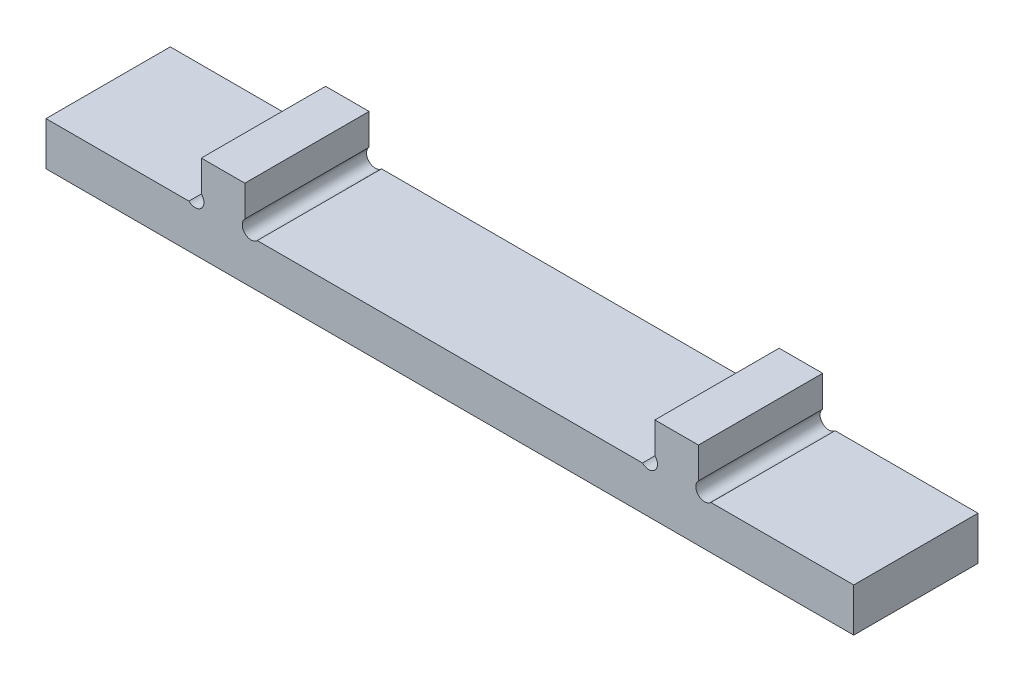
ISO-10303-21;
HEADER;
FILE_DESCRIPTION(('STEP AP214'),'2;1');
FILE_NAME('part.step','',(''),(''),'','','');
FILE_SCHEMA(('AUTOMOTIVE_DESIGN { 1 0 10303 214 1 1 1 1 }'));
ENDSEC;
DATA;
#1=APPLICATION_CONTEXT('core data for automotive mechanical design processes');
#2=APPLICATION_PROTOCOL_DEFINITION('international standard','automotive_design',2000,#1);
#3=PRODUCT_CONTEXT('',#1,'mechanical');
#4=PRODUCT('Part','Part','',(#3));
#5=PRODUCT_RELATED_PRODUCT_CATEGORY('part','',(#4));
#6=PRODUCT_DEFINITION_FORMATION('','',#4);
#7=PRODUCT_DEFINITION_CONTEXT('part definition',#1,'design');
#8=PRODUCT_DEFINITION('design','',#6,#7);
#9=PRODUCT_DEFINITION_SHAPE('','',#8);
#10=(LENGTH_UNIT() NAMED_UNIT(*) SI_UNIT(.MILLI.,.METRE.));
#11=(NAMED_UNIT(*) PLANE_ANGLE_UNIT() SI_UNIT($,.RADIAN.));
#12=(NAMED_UNIT(*) SI_UNIT($,.STERADIAN.) SOLID_ANGLE_UNIT());
#13=UNCERTAINTY_MEASURE_WITH_UNIT(LENGTH_MEASURE(1.E-05),#10,'distance_accuracy_value','');
#14=(GEOMETRIC_REPRESENTATION_CONTEXT(3) GLOBAL_UNCERTAINTY_ASSIGNED_CONTEXT((#13)) GLOBAL_UNIT_ASSIGNED_CONTEXT((#10,
#11,#12)) REPRESENTATION_CONTEXT('',''));
#15=CARTESIAN_POINT('',(0.,0.,0.));
#16=DIRECTION('',(0.,0.,1.));
#17=DIRECTION('',(1.,0.,0.));
#18=AXIS2_PLACEMENT_3D('',#15,#16,#17);
#19=CARTESIAN_POINT('',(52.0699999999999,5.71499999999943,25.4));
#20=DIRECTION('',(0.,0.,-1.));
#21=DIRECTION('',(-1.,0.,0.));
#22=AXIS2_PLACEMENT_3D('',#19,#20,#21);
#23=CYLINDRICAL_SURFACE('',#22,1.79605122421382);
#24=CARTESIAN_POINT('',(52.0699999999999,5.71499999999943,0.));
#25=DIRECTION('',(0.,0.,1.));
#26=DIRECTION('',(1.,0.,0.));
#27=AXIS2_PLACEMENT_3D('',#24,#25,#26);
#28=CIRCLE('',#27,1.79605122421382);
#29=CARTESIAN_POINT('',(50.8,6.98499999999947,0.));
#30=VERTEX_POINT('',#29);
#31=CARTESIAN_POINT('',(53.3400000000005,4.445,0.));
#32=VERTEX_POINT('',#31);
#33=EDGE_CURVE('E188',#30,#32,#28,.T.);
#34=ORIENTED_EDGE('',*,*,#33,.F.);
#35=DIRECTION('',(0.,0.,-1.));
#36=VECTOR('',#35,1.);
#37=CARTESIAN_POINT('',(50.8,6.98499999999947,25.4));
#38=LINE('',#37,#36);
#39=CARTESIAN_POINT('',(50.8,6.98499999999947,25.4));
#40=VERTEX_POINT('',#39);
#41=EDGE_CURVE('E11',#40,#30,#38,.T.);
#42=ORIENTED_EDGE('',*,*,#41,.F.);
#43=CARTESIAN_POINT('',(52.0699999999999,5.71499999999943,25.4));
#44=DIRECTION('',(0.,0.,1.));
#45=DIRECTION('',(1.,0.,0.));
#46=AXIS2_PLACEMENT_3D('',#43,#44,#45);
#47=CIRCLE('',#46,1.79605122421382);
#48=CARTESIAN_POINT('',(53.3400000000005,4.445,25.4));
#49=VERTEX_POINT('',#48);
#50=EDGE_CURVE('E303',#40,#49,#47,.T.);
#51=ORIENTED_EDGE('',*,*,#50,.T.);
#52=DIRECTION('',(0.,0.,-1.));
#53=VECTOR('',#52,1.);
#54=CARTESIAN_POINT('',(53.3400000000005,4.445,25.4));
#55=LINE('',#54,#53);
#56=EDGE_CURVE('E59',#49,#32,#55,.T.);
#57=ORIENTED_EDGE('',*,*,#56,.T.);
#58=EDGE_LOOP('',(#34,#42,#51,#57));
#59=FACE_BOUND('',#58,.T.);
#60=ADVANCED_FACE('F43',(#59),#23,.F.);
#61=CARTESIAN_POINT('',(50.8,0.,25.4));
#62=DIRECTION('',(-1.,0.,0.));
#63=DIRECTION('',(0.,0.,1.));
#64=AXIS2_PLACEMENT_3D('',#61,#62,#63);
#65=PLANE('',#64);
#66=DIRECTION('',(0.,1.,0.));
#67=VECTOR('',#66,1.);
#68=CARTESIAN_POINT('',(50.8,0.,0.));
#69=LINE('',#68,#67);
#70=CARTESIAN_POINT('',(50.8,13.335,0.));
#71=VERTEX_POINT('',#70);
#72=EDGE_CURVE('E190',#30,#71,#69,.T.);
#73=ORIENTED_EDGE('',*,*,#72,.T.);
#74=DIRECTION('',(0.,0.,-1.));
#75=VECTOR('',#74,1.);
#76=CARTESIAN_POINT('',(50.8,13.335,25.4));
#77=LINE('',#76,#75);
#78=CARTESIAN_POINT('',(50.8,13.335,25.4));
#79=VERTEX_POINT('',#78);
#80=EDGE_CURVE('E51',#79,#71,#77,.T.);
#81=ORIENTED_EDGE('',*,*,#80,.F.);
#82=DIRECTION('',(0.,1.,0.));
#83=VECTOR('',#82,1.);
#84=CARTESIAN_POINT('',(50.8,0.,25.4));
#85=LINE('',#84,#83);
#86=EDGE_CURVE('E271',#40,#79,#85,.T.);
#87=ORIENTED_EDGE('',*,*,#86,.F.);
#88=ORIENTED_EDGE('',*,*,#41,.T.);
#89=EDGE_LOOP('',(#73,#81,#87,#88));
#90=FACE_BOUND('',#89,.T.);
#91=ADVANCED_FACE('F305',(#90),#65,.F.);
#92=CARTESIAN_POINT('',(0.,13.335,25.4));
#93=DIRECTION('',(0.,-1.,0.));
#94=DIRECTION('',(1.,0.,0.));
#95=AXIS2_PLACEMENT_3D('',#92,#93,#94);
#96=PLANE('',#95);
#97=DIRECTION('',(-1.,0.,0.));
#98=VECTOR('',#97,1.);
#99=CARTESIAN_POINT('',(0.,13.335,0.));
#100=LINE('',#99,#98);
#101=CARTESIAN_POINT('',(41.91,13.335,0.));
#102=VERTEX_POINT('',#101);
#103=EDGE_CURVE('E192',#71,#102,#100,.T.);
#104=ORIENTED_EDGE('',*,*,#103,.T.);
#105=DIRECTION('',(0.,0.,-1.));
#106=VECTOR('',#105,1.);
#107=CARTESIAN_POINT('',(41.91,13.335,25.4));
#108=LINE('',#107,#106);
#109=CARTESIAN_POINT('',(41.91,13.335,25.4));
#110=VERTEX_POINT('',#109);
#111=EDGE_CURVE('E247',#110,#102,#108,.T.);
#112=ORIENTED_EDGE('',*,*,#111,.F.);
#113=DIRECTION('',(-1.,0.,0.));
#114=VECTOR('',#113,1.);
#115=CARTESIAN_POINT('',(0.,13.335,25.4));
#116=LINE('',#115,#114);
#117=EDGE_CURVE('E255',#79,#110,#116,.T.);
#118=ORIENTED_EDGE('',*,*,#117,.F.);
#119=ORIENTED_EDGE('',*,*,#80,.T.);
#120=EDGE_LOOP('',(#104,#112,#118,#119));
#121=FACE_BOUND('',#120,.T.);
#122=ADVANCED_FACE('F253',(#121),#96,.F.);
#123=CARTESIAN_POINT('',(41.91,0.,25.4));
#124=DIRECTION('',(-1.,0.,0.));
#125=DIRECTION('',(0.,0.,1.));
#126=AXIS2_PLACEMENT_3D('',#123,#124,#125);
#127=PLANE('',#126);
#128=DIRECTION('',(0.,1.,0.));
#129=VECTOR('',#128,1.);
#130=CARTESIAN_POINT('',(41.91,0.,0.));
#131=LINE('',#130,#129);
#132=CARTESIAN_POINT('',(41.91,6.98499999999953,0.));
#133=VERTEX_POINT('',#132);
#134=EDGE_CURVE('E195',#133,#102,#131,.T.);
#135=ORIENTED_EDGE('',*,*,#134,.F.);
#136=DIRECTION('',(0.,0.,-1.));
#137=VECTOR('',#136,1.);
#138=CARTESIAN_POINT('',(41.91,6.98499999999953,25.4));
#139=LINE('',#138,#137);
#140=CARTESIAN_POINT('',(41.91,6.98499999999953,25.4));
#141=VERTEX_POINT('',#140);
#142=EDGE_CURVE('E245',#141,#133,#139,.T.);
#143=ORIENTED_EDGE('',*,*,#142,.F.);
#144=DIRECTION('',(0.,1.,0.));
#145=VECTOR('',#144,1.);
#146=CARTESIAN_POINT('',(41.91,0.,25.4));
#147=LINE('',#146,#145);
#148=EDGE_CURVE('E267',#141,#110,#147,.T.);
#149=ORIENTED_EDGE('',*,*,#148,.T.);
#150=ORIENTED_EDGE('',*,*,#111,.T.);
#151=EDGE_LOOP('',(#135,#143,#149,#150));
#152=FACE_BOUND('',#151,.T.);
#153=ADVANCED_FACE('F263',(#152),#127,.T.);
#154=CARTESIAN_POINT('',(40.64,5.71499999999956,25.4));
#155=DIRECTION('',(0.,0.,-1.));
#156=DIRECTION('',(-1.,0.,0.));
#157=AXIS2_PLACEMENT_3D('',#154,#155,#156);
#158=CYLINDRICAL_SURFACE('',#157,1.79605122421383);
#159=CARTESIAN_POINT('',(40.64,5.71499999999956,0.));
#160=DIRECTION('',(0.,0.,1.));
#161=DIRECTION('',(1.,0.,0.));
#162=AXIS2_PLACEMENT_3D('',#159,#160,#161);
#163=CIRCLE('',#162,1.79605122421383);
#164=CARTESIAN_POINT('',(39.3699999999995,4.445,0.));
#165=VERTEX_POINT('',#164);
#166=EDGE_CURVE('E198',#133,#165,#163,.F.);
#167=ORIENTED_EDGE('',*,*,#166,.T.);
#168=DIRECTION('',(0.,0.,-1.));
#169=VECTOR('',#168,1.);
#170=CARTESIAN_POINT('',(39.3699999999995,4.445,25.4));
#171=LINE('',#170,#169);
#172=CARTESIAN_POINT('',(39.3699999999995,4.445,25.4));
#173=VERTEX_POINT('',#172);
#174=EDGE_CURVE('E243',#173,#165,#171,.T.);
#175=ORIENTED_EDGE('',*,*,#174,.F.);
#176=CARTESIAN_POINT('',(40.64,5.71499999999956,25.4));
#177=DIRECTION('',(0.,0.,1.));
#178=DIRECTION('',(1.,0.,0.));
#179=AXIS2_PLACEMENT_3D('',#176,#177,#178);
#180=CIRCLE('',#179,1.79605122421383);
#181=EDGE_CURVE('E268',#141,#173,#180,.F.);
#182=ORIENTED_EDGE('',*,*,#181,.F.);
#183=ORIENTED_EDGE('',*,*,#142,.T.);
#184=EDGE_LOOP('',(#167,#175,#182,#183));
#185=FACE_BOUND('',#184,.T.);
#186=ADVANCED_FACE('F315',(#185),#158,.F.);
#187=CARTESIAN_POINT('',(0.,4.445,25.4));
#188=DIRECTION('',(0.,1.,0.));
#189=DIRECTION('',(0.,0.,1.));
#190=AXIS2_PLACEMENT_3D('',#187,#188,#189);
#191=PLANE('',#190);
#192=DIRECTION('',(1.,0.,0.));
#193=VECTOR('',#192,1.);
#194=CARTESIAN_POINT('',(0.,4.445,0.));
#195=LINE('',#194,#193);
#196=CARTESIAN_POINT('',(-39.37,4.445,0.));
#197=VERTEX_POINT('',#196);
#198=EDGE_CURVE('E201',#197,#165,#195,.T.);
#199=ORIENTED_EDGE('',*,*,#198,.F.);
#200=DIRECTION('',(0.,0.,-1.));
#201=VECTOR('',#200,1.);
#202=CARTESIAN_POINT('',(-39.37,4.445,25.4));
#203=LINE('',#202,#201);
#204=CARTESIAN_POINT('',(-39.37,4.445,25.4));
#205=VERTEX_POINT('',#204);
#206=EDGE_CURVE('E241',#205,#197,#203,.T.);
#207=ORIENTED_EDGE('',*,*,#206,.F.);
#208=DIRECTION('',(1.,0.,0.));
#209=VECTOR('',#208,1.);
#210=CARTESIAN_POINT('',(0.,4.445,25.4));
#211=LINE('',#210,#209);
#212=EDGE_CURVE('E185',#205,#173,#211,.T.);
#213=ORIENTED_EDGE('',*,*,#212,.T.);
#214=ORIENTED_EDGE('',*,*,#174,.T.);
#215=EDGE_LOOP('',(#199,#207,#213,#214));
#216=FACE_BOUND('',#215,.T.);
#217=ADVANCED_FACE('F318',(#216),#191,.T.);
#218=CARTESIAN_POINT('',(-40.64,5.715,25.4));
#219=DIRECTION('',(0.,0.,-1.));
#220=DIRECTION('',(-1.,0.,0.));
#221=AXIS2_PLACEMENT_3D('',#218,#219,#220);
#222=CYLINDRICAL_SURFACE('',#221,1.79605122421383);
#223=CARTESIAN_POINT('',(-40.64,5.715,0.));
#224=DIRECTION('',(0.,0.,1.));
#225=DIRECTION('',(1.,0.,0.));
#226=AXIS2_PLACEMENT_3D('',#223,#224,#225);
#227=CIRCLE('',#226,1.79605122421383);
#228=CARTESIAN_POINT('',(-41.91,6.98500000000001,0.));
#229=VERTEX_POINT('',#228);
#230=EDGE_CURVE('E204',#229,#197,#227,.T.);
#231=ORIENTED_EDGE('',*,*,#230,.F.);
#232=DIRECTION('',(0.,0.,-1.));
#233=VECTOR('',#232,1.);
#234=CARTESIAN_POINT('',(-41.91,6.98500000000001,25.4));
#235=LINE('',#234,#233);
#236=CARTESIAN_POINT('',(-41.91,6.98500000000001,25.4));
#237=VERTEX_POINT('',#236);
#238=EDGE_CURVE('E239',#237,#229,#235,.T.);
#239=ORIENTED_EDGE('',*,*,#238,.F.);
#240=CARTESIAN_POINT('',(-40.64,5.715,25.4));
#241=DIRECTION('',(0.,0.,1.));
#242=DIRECTION('',(1.,0.,0.));
#243=AXIS2_PLACEMENT_3D('',#240,#241,#242);
#244=CIRCLE('',#243,1.79605122421383);
#245=EDGE_CURVE('E276',#237,#205,#244,.T.);
#246=ORIENTED_EDGE('',*,*,#245,.T.);
#247=ORIENTED_EDGE('',*,*,#206,.T.);
#248=EDGE_LOOP('',(#231,#239,#246,#247));
#249=FACE_BOUND('',#248,.T.);
#250=ADVANCED_FACE('F320',(#249),#222,.F.);
#251=CARTESIAN_POINT('',(-41.91,0.,25.4));
#252=DIRECTION('',(-1.,0.,0.));
#253=DIRECTION('',(0.,0.,1.));
#254=AXIS2_PLACEMENT_3D('',#251,#252,#253);
#255=PLANE('',#254);
#256=DIRECTION('',(0.,1.,0.));
#257=VECTOR('',#256,1.);
#258=CARTESIAN_POINT('',(-41.91,0.,0.));
#259=LINE('',#258,#257);
#260=CARTESIAN_POINT('',(-41.91,13.335,0.));
#261=VERTEX_POINT('',#260);
#262=EDGE_CURVE('E209',#229,#261,#259,.T.);
#263=ORIENTED_EDGE('',*,*,#262,.T.);
#264=DIRECTION('',(0.,0.,-1.));
#265=VECTOR('',#264,1.);
#266=CARTESIAN_POINT('',(-41.91,13.335,25.4));
#267=LINE('',#266,#265);
#268=CARTESIAN_POINT('',(-41.91,13.335,25.4));
#269=VERTEX_POINT('',#268);
#270=EDGE_CURVE('E237',#269,#261,#267,.T.);
#271=ORIENTED_EDGE('',*,*,#270,.F.);
#272=DIRECTION('',(0.,1.,0.));
#273=VECTOR('',#272,1.);
#274=CARTESIAN_POINT('',(-41.91,0.,25.4));
#275=LINE('',#274,#273);
#276=EDGE_CURVE('E279',#237,#269,#275,.T.);
#277=ORIENTED_EDGE('',*,*,#276,.F.);
#278=ORIENTED_EDGE('',*,*,#238,.T.);
#279=EDGE_LOOP('',(#263,#271,#277,#278));
#280=FACE_BOUND('',#279,.T.);
#281=ADVANCED_FACE('F323',(#280),#255,.F.);
#282=CARTESIAN_POINT('',(0.,13.335,25.4));
#283=DIRECTION('',(0.,1.,0.));
#284=DIRECTION('',(-1.,0.,0.));
#285=AXIS2_PLACEMENT_3D('',#282,#283,#284);
#286=PLANE('',#285);
#287=DIRECTION('',(1.,0.,0.));
#288=VECTOR('',#287,1.);
#289=CARTESIAN_POINT('',(0.,13.335,0.));
#290=LINE('',#289,#288);
#291=CARTESIAN_POINT('',(-50.8,13.335,0.));
#292=VERTEX_POINT('',#291);
#293=EDGE_CURVE('E212',#292,#261,#290,.T.);
#294=ORIENTED_EDGE('',*,*,#293,.F.);
#295=DIRECTION('',(0.,0.,-1.));
#296=VECTOR('',#295,1.);
#297=CARTESIAN_POINT('',(-50.8,13.335,25.4));
#298=LINE('',#297,#296);
#299=CARTESIAN_POINT('',(-50.8,13.335,25.4));
#300=VERTEX_POINT('',#299);
#301=EDGE_CURVE('E235',#300,#292,#298,.T.);
#302=ORIENTED_EDGE('',*,*,#301,.F.);
#303=DIRECTION('',(1.,0.,0.));
#304=VECTOR('',#303,1.);
#305=CARTESIAN_POINT('',(0.,13.335,25.4));
#306=LINE('',#305,#304);
#307=EDGE_CURVE('E281',#300,#269,#306,.T.);
#308=ORIENTED_EDGE('',*,*,#307,.T.);
#309=ORIENTED_EDGE('',*,*,#270,.T.);
#310=EDGE_LOOP('',(#294,#302,#308,#309));
#311=FACE_BOUND('',#310,.T.);
#312=ADVANCED_FACE('F327',(#311),#286,.T.);
#313=CARTESIAN_POINT('',(-50.8,0.,25.4));
#314=DIRECTION('',(-1.,0.,0.));
#315=DIRECTION('',(0.,0.,1.));
#316=AXIS2_PLACEMENT_3D('',#313,#314,#315);
#317=PLANE('',#316);
#318=DIRECTION('',(0.,1.,0.));
#319=VECTOR('',#318,1.);
#320=CARTESIAN_POINT('',(-50.8,0.,0.));
#321=LINE('',#320,#319);
#322=CARTESIAN_POINT('',(-50.8,6.98500000000001,0.));
#323=VERTEX_POINT('',#322);
#324=EDGE_CURVE('E215',#323,#292,#321,.T.);
#325=ORIENTED_EDGE('',*,*,#324,.F.);
#326=DIRECTION('',(0.,0.,-1.));
#327=VECTOR('',#326,1.);
#328=CARTESIAN_POINT('',(-50.8,6.98500000000001,25.4));
#329=LINE('',#328,#327);
#330=CARTESIAN_POINT('',(-50.8,6.98500000000001,25.4));
#331=VERTEX_POINT('',#330);
#332=EDGE_CURVE('E233',#331,#323,#329,.T.);
#333=ORIENTED_EDGE('',*,*,#332,.F.);
#334=DIRECTION('',(0.,1.,0.));
#335=VECTOR('',#334,1.);
#336=CARTESIAN_POINT('',(-50.8,0.,25.4));
#337=LINE('',#336,#335);
#338=EDGE_CURVE('E284',#331,#300,#337,.T.);
#339=ORIENTED_EDGE('',*,*,#338,.T.);
#340=ORIENTED_EDGE('',*,*,#301,.T.);
#341=EDGE_LOOP('',(#325,#333,#339,#340));
#342=FACE_BOUND('',#341,.T.);
#343=ADVANCED_FACE('F331',(#342),#317,.T.);
#344=CARTESIAN_POINT('',(-52.07,5.715,25.4));
#345=DIRECTION('',(0.,0.,-1.));
#346=DIRECTION('',(-1.,0.,0.));
#347=AXIS2_PLACEMENT_3D('',#344,#345,#346);
#348=CYLINDRICAL_SURFACE('',#347,1.79605122421383);
#349=CARTESIAN_POINT('',(-52.07,5.715,0.));
#350=DIRECTION('',(0.,0.,1.));
#351=DIRECTION('',(1.,0.,0.));
#352=AXIS2_PLACEMENT_3D('',#349,#350,#351);
#353=CIRCLE('',#352,1.79605122421383);
#354=CARTESIAN_POINT('',(-53.34,4.445,0.));
#355=VERTEX_POINT('',#354);
#356=EDGE_CURVE('E218',#323,#355,#353,.F.);
#357=ORIENTED_EDGE('',*,*,#356,.T.);
#358=DIRECTION('',(0.,0.,-1.));
#359=VECTOR('',#358,1.);
#360=CARTESIAN_POINT('',(-53.34,4.445,25.4));
#361=LINE('',#360,#359);
#362=CARTESIAN_POINT('',(-53.34,4.445,25.4));
#363=VERTEX_POINT('',#362);
#364=EDGE_CURVE('E231',#363,#355,#361,.T.);
#365=ORIENTED_EDGE('',*,*,#364,.F.);
#366=CARTESIAN_POINT('',(-52.07,5.715,25.4));
#367=DIRECTION('',(0.,0.,1.));
#368=DIRECTION('',(1.,0.,0.));
#369=AXIS2_PLACEMENT_3D('',#366,#367,#368);
#370=CIRCLE('',#369,1.79605122421383);
#371=EDGE_CURVE('E287',#331,#363,#370,.F.);
#372=ORIENTED_EDGE('',*,*,#371,.F.);
#373=ORIENTED_EDGE('',*,*,#332,.T.);
#374=EDGE_LOOP('',(#357,#365,#372,#373));
#375=FACE_BOUND('',#374,.T.);
#376=ADVANCED_FACE('F297',(#375),#348,.F.);
#377=CARTESIAN_POINT('',(-82.55,4.445,0.));
#378=VERTEX_POINT('',#377);
#379=EDGE_CURVE('E206',#378,#355,#195,.T.);
#380=ORIENTED_EDGE('',*,*,#379,.F.);
#381=DIRECTION('',(0.,0.,-1.));
#382=VECTOR('',#381,1.);
#383=CARTESIAN_POINT('',(-82.55,4.445,25.4));
#384=LINE('',#383,#382);
#385=CARTESIAN_POINT('',(-82.55,4.445,25.4));
#386=VERTEX_POINT('',#385);
#387=EDGE_CURVE('E229',#386,#378,#384,.T.);
#388=ORIENTED_EDGE('',*,*,#387,.F.);
#389=EDGE_CURVE('E184',#386,#363,#211,.T.);
#390=ORIENTED_EDGE('',*,*,#389,.T.);
#391=ORIENTED_EDGE('',*,*,#364,.T.);
#392=EDGE_LOOP('',(#380,#388,#390,#391));
#393=FACE_BOUND('',#392,.T.);
#394=ADVANCED_FACE('F291',(#393),#191,.T.);
#395=CARTESIAN_POINT('',(-82.55,0.,25.4));
#396=DIRECTION('',(1.,0.,0.));
#397=DIRECTION('',(0.,0.,-1.));
#398=AXIS2_PLACEMENT_3D('',#395,#396,#397);
#399=PLANE('',#398);
#400=DIRECTION('',(0.,-1.,0.));
#401=VECTOR('',#400,1.);
#402=CARTESIAN_POINT('',(-82.55,0.,0.));
#403=LINE('',#402,#401);
#404=CARTESIAN_POINT('',(-82.55,-4.445,0.));
#405=VERTEX_POINT('',#404);
#406=EDGE_CURVE('E221',#378,#405,#403,.T.);
#407=ORIENTED_EDGE('',*,*,#406,.T.);
#408=DIRECTION('',(0.,0.,-1.));
#409=VECTOR('',#408,1.);
#410=CARTESIAN_POINT('',(-82.55,-4.445,25.4));
#411=LINE('',#410,#409);
#412=CARTESIAN_POINT('',(-82.55,-4.445,25.4));
#413=VERTEX_POINT('',#412);
#414=EDGE_CURVE('E178',#413,#405,#411,.T.);
#415=ORIENTED_EDGE('',*,*,#414,.F.);
#416=DIRECTION('',(0.,-1.,0.));
#417=VECTOR('',#416,1.);
#418=CARTESIAN_POINT('',(-82.55,0.,25.4));
#419=LINE('',#418,#417);
#420=EDGE_CURVE('E166',#386,#413,#419,.T.);
#421=ORIENTED_EDGE('',*,*,#420,.F.);
#422=ORIENTED_EDGE('',*,*,#387,.T.);
#423=EDGE_LOOP('',(#407,#415,#421,#422));
#424=FACE_BOUND('',#423,.T.);
#425=ADVANCED_FACE('F338',(#424),#399,.F.);
#426=CARTESIAN_POINT('',(0.,-4.445,25.4));
#427=DIRECTION('',(0.,1.,0.));
#428=DIRECTION('',(0.,0.,1.));
#429=AXIS2_PLACEMENT_3D('',#426,#427,#428);
#430=PLANE('',#429);
#431=DIRECTION('',(1.,0.,0.));
#432=VECTOR('',#431,1.);
#433=CARTESIAN_POINT('',(0.,-4.445,0.));
#434=LINE('',#433,#432);
#435=CARTESIAN_POINT('',(82.55,-4.445,0.));
#436=VERTEX_POINT('',#435);
#437=EDGE_CURVE('E175',#405,#436,#434,.T.);
#438=ORIENTED_EDGE('',*,*,#437,.T.);
#439=DIRECTION('',(0.,0.,-1.));
#440=VECTOR('',#439,1.);
#441=CARTESIAN_POINT('',(82.55,-4.445,25.4));
#442=LINE('',#441,#440);
#443=CARTESIAN_POINT('',(82.55,-4.445,25.4));
#444=VERTEX_POINT('',#443);
#445=EDGE_CURVE('E172',#444,#436,#442,.T.);
#446=ORIENTED_EDGE('',*,*,#445,.F.);
#447=DIRECTION('',(1.,0.,0.));
#448=VECTOR('',#447,1.);
#449=CARTESIAN_POINT('',(0.,-4.445,25.4));
#450=LINE('',#449,#448);
#451=EDGE_CURVE('E157',#413,#444,#450,.T.);
#452=ORIENTED_EDGE('',*,*,#451,.F.);
#453=ORIENTED_EDGE('',*,*,#414,.T.);
#454=EDGE_LOOP('',(#438,#446,#452,#453));
#455=FACE_BOUND('',#454,.T.);
#456=ADVANCED_FACE('F173',(#455),#430,.F.);
#457=CARTESIAN_POINT('',(82.55,0.,25.4));
#458=DIRECTION('',(1.,0.,0.));
#459=DIRECTION('',(0.,0.,-1.));
#460=AXIS2_PLACEMENT_3D('',#457,#458,#459);
#461=PLANE('',#460);
#462=DIRECTION('',(0.,-1.,0.));
#463=VECTOR('',#462,1.);
#464=CARTESIAN_POINT('',(82.55,0.,0.));
#465=LINE('',#464,#463);
#466=CARTESIAN_POINT('',(82.55,4.445,0.));
#467=VERTEX_POINT('',#466);
#468=EDGE_CURVE('E224',#467,#436,#465,.T.);
#469=ORIENTED_EDGE('',*,*,#468,.F.);
#470=DIRECTION('',(0.,0.,-1.));
#471=VECTOR('',#470,1.);
#472=CARTESIAN_POINT('',(82.55,4.445,25.4));
#473=LINE('',#472,#471);
#474=CARTESIAN_POINT('',(82.55,4.445,25.4));
#475=VERTEX_POINT('',#474);
#476=EDGE_CURVE('E108',#475,#467,#473,.T.);
#477=ORIENTED_EDGE('',*,*,#476,.F.);
#478=DIRECTION('',(0.,-1.,0.));
#479=VECTOR('',#478,1.);
#480=CARTESIAN_POINT('',(82.55,0.,25.4));
#481=LINE('',#480,#479);
#482=EDGE_CURVE('E163',#475,#444,#481,.T.);
#483=ORIENTED_EDGE('',*,*,#482,.T.);
#484=ORIENTED_EDGE('',*,*,#445,.T.);
#485=EDGE_LOOP('',(#469,#477,#483,#484));
#486=FACE_BOUND('',#485,.T.);
#487=ADVANCED_FACE('F180',(#486),#461,.T.);
#488=EDGE_CURVE('E205',#32,#467,#195,.T.);
#489=ORIENTED_EDGE('',*,*,#488,.F.);
#490=ORIENTED_EDGE('',*,*,#56,.F.);
#491=EDGE_CURVE('E181',#49,#475,#211,.T.);
#492=ORIENTED_EDGE('',*,*,#491,.T.);
#493=ORIENTED_EDGE('',*,*,#476,.T.);
#494=EDGE_LOOP('',(#489,#490,#492,#493));
#495=FACE_BOUND('',#494,.T.);
#496=ADVANCED_FACE('F346',(#495),#191,.T.);
#497=CARTESIAN_POINT('',(0.,0.,25.4));
#498=DIRECTION('',(0.,0.,1.));
#499=DIRECTION('',(1.,0.,0.));
#500=AXIS2_PLACEMENT_3D('',#497,#498,#499);
#501=PLANE('',#500);
#502=ORIENTED_EDGE('',*,*,#50,.F.);
#503=ORIENTED_EDGE('',*,*,#86,.T.);
#504=ORIENTED_EDGE('',*,*,#117,.T.);
#505=ORIENTED_EDGE('',*,*,#148,.F.);
#506=ORIENTED_EDGE('',*,*,#181,.T.);
#507=ORIENTED_EDGE('',*,*,#212,.F.);
#508=ORIENTED_EDGE('',*,*,#245,.F.);
#509=ORIENTED_EDGE('',*,*,#276,.T.);
#510=ORIENTED_EDGE('',*,*,#307,.F.);
#511=ORIENTED_EDGE('',*,*,#338,.F.);
#512=ORIENTED_EDGE('',*,*,#371,.T.);
#513=ORIENTED_EDGE('',*,*,#389,.F.);
#514=ORIENTED_EDGE('',*,*,#420,.T.);
#515=ORIENTED_EDGE('',*,*,#451,.T.);
#516=ORIENTED_EDGE('',*,*,#482,.F.);
#517=ORIENTED_EDGE('',*,*,#491,.F.);
#518=EDGE_LOOP('',(#502,#503,#504,#505,#506,#507,#508,#509,#510,#511,#512,#513,#514,#515,#516,#517));
#519=FACE_BOUND('',#518,.T.);
#520=ADVANCED_FACE('F160',(#519),#501,.T.);
#521=CARTESIAN_POINT('',(0.,0.,0.));
#522=DIRECTION('',(0.,0.,1.));
#523=DIRECTION('',(1.,0.,0.));
#524=AXIS2_PLACEMENT_3D('',#521,#522,#523);
#525=PLANE('',#524);
#526=ORIENTED_EDGE('',*,*,#33,.T.);
#527=ORIENTED_EDGE('',*,*,#488,.T.);
#528=ORIENTED_EDGE('',*,*,#468,.T.);
#529=ORIENTED_EDGE('',*,*,#437,.F.);
#530=ORIENTED_EDGE('',*,*,#406,.F.);
#531=ORIENTED_EDGE('',*,*,#379,.T.);
#532=ORIENTED_EDGE('',*,*,#356,.F.);
#533=ORIENTED_EDGE('',*,*,#324,.T.);
#534=ORIENTED_EDGE('',*,*,#293,.T.);
#535=ORIENTED_EDGE('',*,*,#262,.F.);
#536=ORIENTED_EDGE('',*,*,#230,.T.);
#537=ORIENTED_EDGE('',*,*,#198,.T.);
#538=ORIENTED_EDGE('',*,*,#166,.F.);
#539=ORIENTED_EDGE('',*,*,#134,.T.);
#540=ORIENTED_EDGE('',*,*,#103,.F.);
#541=ORIENTED_EDGE('',*,*,#72,.F.);
#542=EDGE_LOOP('',(#526,#527,#528,#529,#530,#531,#532,#533,#534,#535,#536,#537,#538,#539,#540,#541));
#543=FACE_BOUND('',#542,.T.);
#544=ADVANCED_FACE('F259',(#543),#525,.F.);
#545=CLOSED_SHELL('',(#60,#91,#122,#153,#186,#217,#250,#281,#312,#343,#376,#394,#425,#456,#487,
#496,#520,#544));
#546=MANIFOLD_SOLID_BREP('B2',#545);
#547=ADVANCED_BREP_SHAPE_REPRESENTATION('',(#18,#546),#14);
#548=SHAPE_DEFINITION_REPRESENTATION(#9,#547);
ENDSEC;
END-ISO-10303-21;
